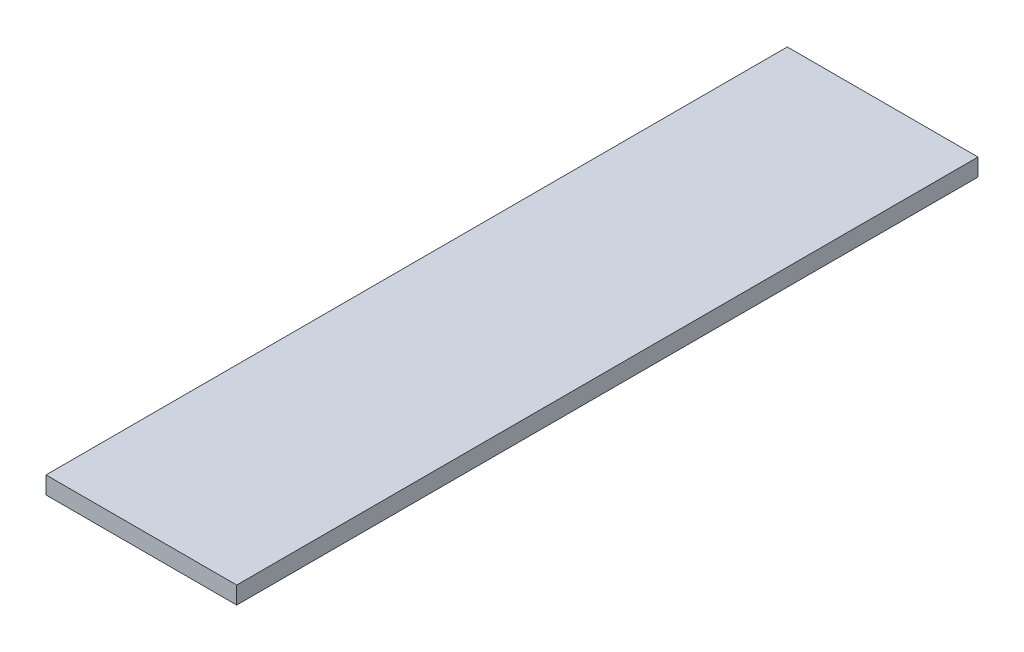
ISO-10303-21;
HEADER;
FILE_DESCRIPTION(('STEP AP214'),'2;1');
FILE_NAME('part.step','',(''),(''),'','','');
FILE_SCHEMA(('AUTOMOTIVE_DESIGN { 1 0 10303 214 1 1 1 1 }'));
ENDSEC;
DATA;
#1=APPLICATION_CONTEXT('core data for automotive mechanical design processes');
#2=APPLICATION_PROTOCOL_DEFINITION('international standard','automotive_design',2000,#1);
#3=PRODUCT_CONTEXT('',#1,'mechanical');
#4=PRODUCT('Part','Part','',(#3));
#5=PRODUCT_RELATED_PRODUCT_CATEGORY('part','',(#4));
#6=PRODUCT_DEFINITION_FORMATION('','',#4);
#7=PRODUCT_DEFINITION_CONTEXT('part definition',#1,'design');
#8=PRODUCT_DEFINITION('design','',#6,#7);
#9=PRODUCT_DEFINITION_SHAPE('','',#8);
#10=(LENGTH_UNIT() NAMED_UNIT(*) SI_UNIT(.MILLI.,.METRE.));
#11=(NAMED_UNIT(*) PLANE_ANGLE_UNIT() SI_UNIT($,.RADIAN.));
#12=(NAMED_UNIT(*) SI_UNIT($,.STERADIAN.) SOLID_ANGLE_UNIT());
#13=UNCERTAINTY_MEASURE_WITH_UNIT(LENGTH_MEASURE(1.E-05),#10,'distance_accuracy_value','');
#14=(GEOMETRIC_REPRESENTATION_CONTEXT(3) GLOBAL_UNCERTAINTY_ASSIGNED_CONTEXT((#13)) GLOBAL_UNIT_ASSIGNED_CONTEXT((#10,
#11,#12)) REPRESENTATION_CONTEXT('',''));
#15=CARTESIAN_POINT('',(0.,0.,0.));
#16=DIRECTION('',(0.,0.,1.));
#17=DIRECTION('',(1.,0.,0.));
#18=AXIS2_PLACEMENT_3D('',#15,#16,#17);
#19=CARTESIAN_POINT('',(-528.085778854874,1862.99678718592,812.8));
#20=DIRECTION('',(-1.,0.,0.));
#21=DIRECTION('',(0.,0.,1.));
#22=AXIS2_PLACEMENT_3D('',#19,#20,#21);
#23=PLANE('',#22);
#24=DIRECTION('',(0.,1.,0.));
#25=VECTOR('',#24,1.);
#26=CARTESIAN_POINT('',(-528.085778854874,1862.99678718592,0.));
#27=LINE('',#26,#25);
#28=CARTESIAN_POINT('',(-528.085778854874,1843.94678718592,0.));
#29=VERTEX_POINT('',#28);
#30=CARTESIAN_POINT('',(-528.085778854874,1862.99678718592,0.));
#31=VERTEX_POINT('',#30);
#32=EDGE_CURVE('E98',#29,#31,#27,.T.);
#33=ORIENTED_EDGE('',*,*,#32,.T.);
#34=DIRECTION('',(0.,0.,-1.));
#35=VECTOR('',#34,1.);
#36=CARTESIAN_POINT('',(-528.085778854874,1862.99678718592,812.8));
#37=LINE('',#36,#35);
#38=CARTESIAN_POINT('',(-528.085778854874,1862.99678718592,812.8));
#39=VERTEX_POINT('',#38);
#40=EDGE_CURVE('E11',#39,#31,#37,.T.);
#41=ORIENTED_EDGE('',*,*,#40,.F.);
#42=DIRECTION('',(0.,1.,0.));
#43=VECTOR('',#42,1.);
#44=CARTESIAN_POINT('',(-528.085778854874,1862.99678718592,812.8));
#45=LINE('',#44,#43);
#46=CARTESIAN_POINT('',(-528.085778854874,1843.94678718592,812.8));
#47=VERTEX_POINT('',#46);
#48=EDGE_CURVE('E86',#47,#39,#45,.T.);
#49=ORIENTED_EDGE('',*,*,#48,.F.);
#50=DIRECTION('',(0.,0.,-1.));
#51=VECTOR('',#50,1.);
#52=CARTESIAN_POINT('',(-528.085778854874,1843.94678718592,812.8));
#53=LINE('',#52,#51);
#54=EDGE_CURVE('E94',#47,#29,#53,.T.);
#55=ORIENTED_EDGE('',*,*,#54,.T.);
#56=EDGE_LOOP('',(#33,#41,#49,#55));
#57=FACE_BOUND('',#56,.T.);
#58=ADVANCED_FACE('F35',(#57),#23,.F.);
#59=CARTESIAN_POINT('',(-528.085778854874,1862.99678718592,812.8));
#60=DIRECTION('',(0.,-1.,0.));
#61=DIRECTION('',(0.,0.,-1.));
#62=AXIS2_PLACEMENT_3D('',#59,#60,#61);
#63=PLANE('',#62);
#64=DIRECTION('',(-1.,0.,0.));
#65=VECTOR('',#64,1.);
#66=CARTESIAN_POINT('',(-528.085778854874,1862.99678718592,0.));
#67=LINE('',#66,#65);
#68=CARTESIAN_POINT('',(-737.184498249528,1862.99678718592,0.));
#69=VERTEX_POINT('',#68);
#70=EDGE_CURVE('E90',#31,#69,#67,.T.);
#71=ORIENTED_EDGE('',*,*,#70,.T.);
#72=DIRECTION('',(0.,0.,-1.));
#73=VECTOR('',#72,1.);
#74=CARTESIAN_POINT('',(-737.184498249528,1862.99678718592,812.8));
#75=LINE('',#74,#73);
#76=CARTESIAN_POINT('',(-737.184498249528,1862.99678718592,812.8));
#77=VERTEX_POINT('',#76);
#78=EDGE_CURVE('E43',#77,#69,#75,.T.);
#79=ORIENTED_EDGE('',*,*,#78,.F.);
#80=DIRECTION('',(-1.,0.,0.));
#81=VECTOR('',#80,1.);
#82=CARTESIAN_POINT('',(-528.085778854874,1862.99678718592,812.8));
#83=LINE('',#82,#81);
#84=EDGE_CURVE('E81',#39,#77,#83,.T.);
#85=ORIENTED_EDGE('',*,*,#84,.F.);
#86=ORIENTED_EDGE('',*,*,#40,.T.);
#87=EDGE_LOOP('',(#71,#79,#85,#86));
#88=FACE_BOUND('',#87,.T.);
#89=ADVANCED_FACE('F89',(#88),#63,.F.);
#90=CARTESIAN_POINT('',(-737.184498249528,1862.99678718592,812.8));
#91=DIRECTION('',(1.,0.,0.));
#92=DIRECTION('',(0.,0.,-1.));
#93=AXIS2_PLACEMENT_3D('',#90,#91,#92);
#94=PLANE('',#93);
#95=DIRECTION('',(0.,-1.,0.));
#96=VECTOR('',#95,1.);
#97=CARTESIAN_POINT('',(-737.184498249528,1862.99678718592,0.));
#98=LINE('',#97,#96);
#99=CARTESIAN_POINT('',(-737.184498249528,1843.94678718592,0.));
#100=VERTEX_POINT('',#99);
#101=EDGE_CURVE('E68',#69,#100,#98,.T.);
#102=ORIENTED_EDGE('',*,*,#101,.T.);
#103=DIRECTION('',(0.,0.,-1.));
#104=VECTOR('',#103,1.);
#105=CARTESIAN_POINT('',(-737.184498249528,1843.94678718592,812.8));
#106=LINE('',#105,#104);
#107=CARTESIAN_POINT('',(-737.184498249528,1843.94678718592,812.8));
#108=VERTEX_POINT('',#107);
#109=EDGE_CURVE('E91',#108,#100,#106,.T.);
#110=ORIENTED_EDGE('',*,*,#109,.F.);
#111=DIRECTION('',(0.,-1.,0.));
#112=VECTOR('',#111,1.);
#113=CARTESIAN_POINT('',(-737.184498249528,1862.99678718592,812.8));
#114=LINE('',#113,#112);
#115=EDGE_CURVE('E84',#77,#108,#114,.T.);
#116=ORIENTED_EDGE('',*,*,#115,.F.);
#117=ORIENTED_EDGE('',*,*,#78,.T.);
#118=EDGE_LOOP('',(#102,#110,#116,#117));
#119=FACE_BOUND('',#118,.T.);
#120=ADVANCED_FACE('F92',(#119),#94,.F.);
#121=CARTESIAN_POINT('',(-528.085778854874,1843.94678718592,812.8));
#122=DIRECTION('',(0.,1.,0.));
#123=DIRECTION('',(0.,0.,1.));
#124=AXIS2_PLACEMENT_3D('',#121,#122,#123);
#125=PLANE('',#124);
#126=DIRECTION('',(1.,0.,0.));
#127=VECTOR('',#126,1.);
#128=CARTESIAN_POINT('',(-528.085778854874,1843.94678718592,0.));
#129=LINE('',#128,#127);
#130=EDGE_CURVE('E74',#100,#29,#129,.T.);
#131=ORIENTED_EDGE('',*,*,#130,.T.);
#132=ORIENTED_EDGE('',*,*,#54,.F.);
#133=DIRECTION('',(1.,0.,0.));
#134=VECTOR('',#133,1.);
#135=CARTESIAN_POINT('',(-528.085778854874,1843.94678718592,812.8));
#136=LINE('',#135,#134);
#137=EDGE_CURVE('E51',#108,#47,#136,.T.);
#138=ORIENTED_EDGE('',*,*,#137,.F.);
#139=ORIENTED_EDGE('',*,*,#109,.T.);
#140=EDGE_LOOP('',(#131,#132,#138,#139));
#141=FACE_BOUND('',#140,.T.);
#142=ADVANCED_FACE('F105',(#141),#125,.F.);
#143=CARTESIAN_POINT('',(0.,0.,812.8));
#144=DIRECTION('',(0.,0.,-1.));
#145=DIRECTION('',(-1.,0.,0.));
#146=AXIS2_PLACEMENT_3D('',#143,#144,#145);
#147=PLANE('',#146);
#148=ORIENTED_EDGE('',*,*,#48,.T.);
#149=ORIENTED_EDGE('',*,*,#84,.T.);
#150=ORIENTED_EDGE('',*,*,#115,.T.);
#151=ORIENTED_EDGE('',*,*,#137,.T.);
#152=EDGE_LOOP('',(#148,#149,#150,#151));
#153=FACE_BOUND('',#152,.T.);
#154=ADVANCED_FACE('F82',(#153),#147,.F.);
#155=CARTESIAN_POINT('',(0.,0.,0.));
#156=DIRECTION('',(0.,0.,-1.));
#157=DIRECTION('',(-1.,0.,0.));
#158=AXIS2_PLACEMENT_3D('',#155,#156,#157);
#159=PLANE('',#158);
#160=ORIENTED_EDGE('',*,*,#32,.F.);
#161=ORIENTED_EDGE('',*,*,#130,.F.);
#162=ORIENTED_EDGE('',*,*,#101,.F.);
#163=ORIENTED_EDGE('',*,*,#70,.F.);
#164=EDGE_LOOP('',(#160,#161,#162,#163));
#165=FACE_BOUND('',#164,.T.);
#166=ADVANCED_FACE('F108',(#165),#159,.T.);
#167=CLOSED_SHELL('',(#58,#89,#120,#142,#154,#166));
#168=MANIFOLD_SOLID_BREP('B2',#167);
#169=ADVANCED_BREP_SHAPE_REPRESENTATION('',(#18,#168),#14);
#170=SHAPE_DEFINITION_REPRESENTATION(#9,#169);
ENDSEC;
END-ISO-10303-21;
